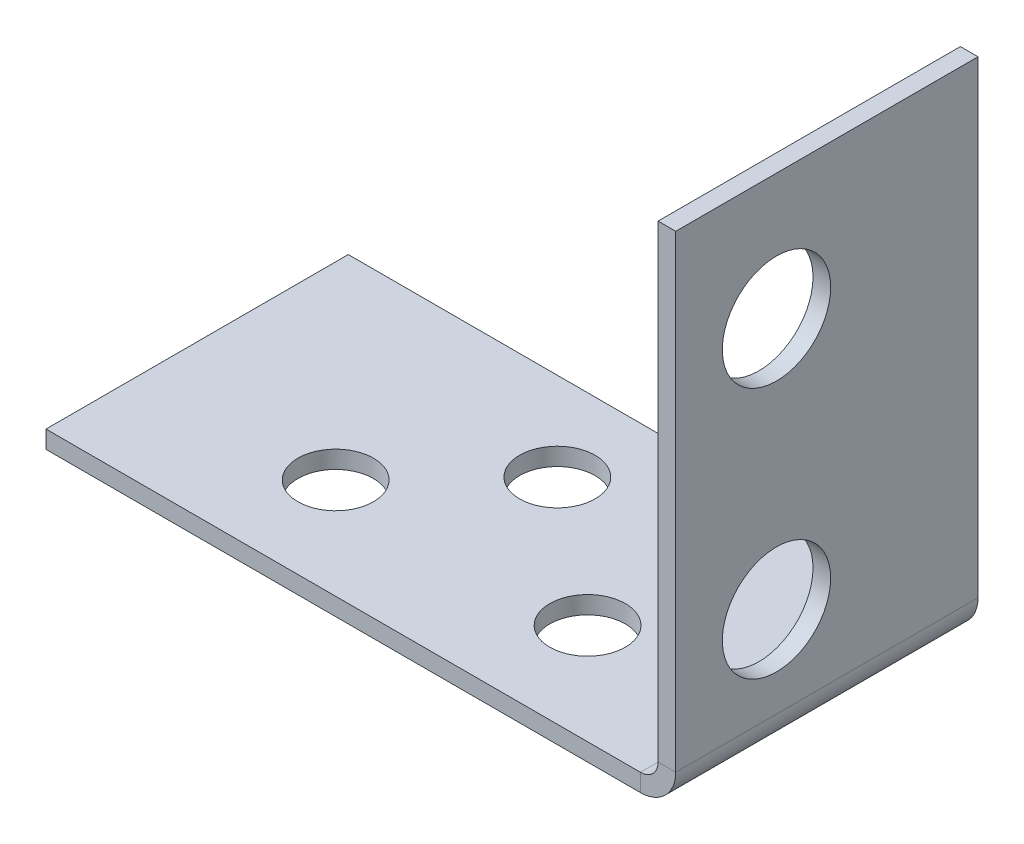
ISO-10303-21;
HEADER;
FILE_DESCRIPTION(('STEP AP214'),'2;1');
FILE_NAME('part.step','',(''),(''),'','','');
FILE_SCHEMA(('AUTOMOTIVE_DESIGN { 1 0 10303 214 1 1 1 1 }'));
ENDSEC;
DATA;
#1=APPLICATION_CONTEXT('core data for automotive mechanical design processes');
#2=APPLICATION_PROTOCOL_DEFINITION('international standard','automotive_design',2000,#1);
#3=PRODUCT_CONTEXT('',#1,'mechanical');
#4=PRODUCT('Part','Part','',(#3));
#5=PRODUCT_RELATED_PRODUCT_CATEGORY('part','',(#4));
#6=PRODUCT_DEFINITION_FORMATION('','',#4);
#7=PRODUCT_DEFINITION_CONTEXT('part definition',#1,'design');
#8=PRODUCT_DEFINITION('design','',#6,#7);
#9=PRODUCT_DEFINITION_SHAPE('','',#8);
#10=(LENGTH_UNIT() NAMED_UNIT(*) SI_UNIT(.MILLI.,.METRE.));
#11=(NAMED_UNIT(*) PLANE_ANGLE_UNIT() SI_UNIT($,.RADIAN.));
#12=(NAMED_UNIT(*) SI_UNIT($,.STERADIAN.) SOLID_ANGLE_UNIT());
#13=UNCERTAINTY_MEASURE_WITH_UNIT(LENGTH_MEASURE(1.E-05),#10,'distance_accuracy_value','');
#14=(GEOMETRIC_REPRESENTATION_CONTEXT(3) GLOBAL_UNCERTAINTY_ASSIGNED_CONTEXT((#13)) GLOBAL_UNIT_ASSIGNED_CONTEXT((#10,
#11,#12)) REPRESENTATION_CONTEXT('',''));
#15=CARTESIAN_POINT('',(0.,0.,0.));
#16=DIRECTION('',(0.,0.,1.));
#17=DIRECTION('',(1.,0.,0.));
#18=AXIS2_PLACEMENT_3D('',#15,#16,#17);
#19=CARTESIAN_POINT('',(23.6,0.,12.));
#20=DIRECTION('',(0.,0.,1.));
#21=DIRECTION('',(1.,0.,0.));
#22=AXIS2_PLACEMENT_3D('',#19,#20,#21);
#23=PLANE('',#22);
#24=DIRECTION('',(0.,1.,0.));
#25=VECTOR('',#24,1.);
#26=CARTESIAN_POINT('',(23.6,0.,12.));
#27=LINE('',#26,#25);
#28=CARTESIAN_POINT('',(23.6,0.,12.));
#29=VERTEX_POINT('',#28);
#30=CARTESIAN_POINT('',(23.6,0.7,12.));
#31=VERTEX_POINT('',#30);
#32=EDGE_CURVE('E11',#29,#31,#27,.T.);
#33=ORIENTED_EDGE('',*,*,#32,.F.);
#34=CARTESIAN_POINT('',(23.6,1.4,12.));
#35=DIRECTION('',(0.,0.,-1.));
#36=DIRECTION('',(-1.,0.,0.));
#37=AXIS2_PLACEMENT_3D('',#34,#35,#36);
#38=CIRCLE('',#37,1.4);
#39=CARTESIAN_POINT('',(25.,1.4,12.));
#40=VERTEX_POINT('',#39);
#41=EDGE_CURVE('E131',#29,#40,#38,.F.);
#42=ORIENTED_EDGE('',*,*,#41,.T.);
#43=DIRECTION('',(1.,0.,0.));
#44=VECTOR('',#43,1.);
#45=CARTESIAN_POINT('',(24.3,1.4,12.));
#46=LINE('',#45,#44);
#47=CARTESIAN_POINT('',(24.3,1.4,12.));
#48=VERTEX_POINT('',#47);
#49=EDGE_CURVE('E49',#48,#40,#46,.T.);
#50=ORIENTED_EDGE('',*,*,#49,.F.);
#51=CARTESIAN_POINT('',(23.6,1.4,12.));
#52=DIRECTION('',(0.,0.,1.));
#53=DIRECTION('',(1.,0.,0.));
#54=AXIS2_PLACEMENT_3D('',#51,#52,#53);
#55=CIRCLE('',#54,0.7);
#56=EDGE_CURVE('E138',#31,#48,#55,.T.);
#57=ORIENTED_EDGE('',*,*,#56,.F.);
#58=EDGE_LOOP('',(#33,#42,#50,#57));
#59=FACE_BOUND('',#58,.T.);
#60=ADVANCED_FACE('F41',(#59),#23,.T.);
#61=CARTESIAN_POINT('',(24.3,1.4,12.));
#62=DIRECTION('',(0.,0.,1.));
#63=DIRECTION('',(1.,0.,0.));
#64=AXIS2_PLACEMENT_3D('',#61,#62,#63);
#65=PLANE('',#64);
#66=DIRECTION('',(1.,0.,0.));
#67=VECTOR('',#66,1.);
#68=CARTESIAN_POINT('',(0.,0.,12.));
#69=LINE('',#68,#67);
#70=CARTESIAN_POINT('',(0.,0.,12.));
#71=VERTEX_POINT('',#70);
#72=EDGE_CURVE('E126',#71,#29,#69,.T.);
#73=ORIENTED_EDGE('',*,*,#72,.T.);
#74=ORIENTED_EDGE('',*,*,#32,.T.);
#75=DIRECTION('',(1.,0.,0.));
#76=VECTOR('',#75,1.);
#77=CARTESIAN_POINT('',(0.,0.7,12.));
#78=LINE('',#77,#76);
#79=CARTESIAN_POINT('',(0.,0.7,12.));
#80=VERTEX_POINT('',#79);
#81=EDGE_CURVE('E136',#80,#31,#78,.T.);
#82=ORIENTED_EDGE('',*,*,#81,.F.);
#83=DIRECTION('',(0.,1.,0.));
#84=VECTOR('',#83,1.);
#85=CARTESIAN_POINT('',(0.,0.,12.));
#86=LINE('',#85,#84);
#87=EDGE_CURVE('E117',#71,#80,#86,.T.);
#88=ORIENTED_EDGE('',*,*,#87,.F.);
#89=EDGE_LOOP('',(#73,#74,#82,#88));
#90=FACE_BOUND('',#89,.T.);
#91=ADVANCED_FACE('F134',(#90),#65,.T.);
#92=CARTESIAN_POINT('',(25.,1.4,0.));
#93=DIRECTION('',(0.,0.,-1.));
#94=DIRECTION('',(-1.,0.,0.));
#95=AXIS2_PLACEMENT_3D('',#92,#93,#94);
#96=PLANE('',#95);
#97=DIRECTION('',(-1.,0.,0.));
#98=VECTOR('',#97,1.);
#99=CARTESIAN_POINT('',(25.,1.4,0.));
#100=LINE('',#99,#98);
#101=CARTESIAN_POINT('',(25.,1.4,0.));
#102=VERTEX_POINT('',#101);
#103=CARTESIAN_POINT('',(24.3,1.4,0.));
#104=VERTEX_POINT('',#103);
#105=EDGE_CURVE('E92',#102,#104,#100,.T.);
#106=ORIENTED_EDGE('',*,*,#105,.F.);
#107=CARTESIAN_POINT('',(23.6,1.4,0.));
#108=DIRECTION('',(0.,0.,-1.));
#109=DIRECTION('',(-1.,0.,0.));
#110=AXIS2_PLACEMENT_3D('',#107,#108,#109);
#111=CIRCLE('',#110,1.4);
#112=CARTESIAN_POINT('',(23.6,0.,0.));
#113=VERTEX_POINT('',#112);
#114=EDGE_CURVE('E161',#113,#102,#111,.F.);
#115=ORIENTED_EDGE('',*,*,#114,.F.);
#116=DIRECTION('',(0.,-1.,0.));
#117=VECTOR('',#116,1.);
#118=CARTESIAN_POINT('',(23.6,0.7,0.));
#119=LINE('',#118,#117);
#120=CARTESIAN_POINT('',(23.6,0.7,0.));
#121=VERTEX_POINT('',#120);
#122=EDGE_CURVE('E85',#121,#113,#119,.T.);
#123=ORIENTED_EDGE('',*,*,#122,.F.);
#124=CARTESIAN_POINT('',(23.6,1.4,0.));
#125=DIRECTION('',(0.,0.,1.));
#126=DIRECTION('',(1.,0.,0.));
#127=AXIS2_PLACEMENT_3D('',#124,#125,#126);
#128=CIRCLE('',#127,0.7);
#129=EDGE_CURVE('E154',#121,#104,#128,.T.);
#130=ORIENTED_EDGE('',*,*,#129,.T.);
#131=EDGE_LOOP('',(#106,#115,#123,#130));
#132=FACE_BOUND('',#131,.T.);
#133=ADVANCED_FACE('F193',(#132),#96,.T.);
#134=CARTESIAN_POINT('',(23.6,0.7,0.));
#135=DIRECTION('',(0.,0.,-1.));
#136=DIRECTION('',(-1.,0.,0.));
#137=AXIS2_PLACEMENT_3D('',#134,#135,#136);
#138=PLANE('',#137);
#139=DIRECTION('',(0.,1.,0.));
#140=VECTOR('',#139,1.);
#141=CARTESIAN_POINT('',(25.,0.,0.));
#142=LINE('',#141,#140);
#143=CARTESIAN_POINT('',(25.,20.,0.));
#144=VERTEX_POINT('',#143);
#145=EDGE_CURVE('E144',#102,#144,#142,.T.);
#146=ORIENTED_EDGE('',*,*,#145,.F.);
#147=ORIENTED_EDGE('',*,*,#105,.T.);
#148=DIRECTION('',(0.,1.,0.));
#149=VECTOR('',#148,1.);
#150=CARTESIAN_POINT('',(24.3,0.,0.));
#151=LINE('',#150,#149);
#152=CARTESIAN_POINT('',(24.3,20.,0.));
#153=VERTEX_POINT('',#152);
#154=EDGE_CURVE('E151',#104,#153,#151,.T.);
#155=ORIENTED_EDGE('',*,*,#154,.T.);
#156=DIRECTION('',(1.,0.,0.));
#157=VECTOR('',#156,1.);
#158=CARTESIAN_POINT('',(24.3,20.,0.));
#159=LINE('',#158,#157);
#160=EDGE_CURVE('E147',#153,#144,#159,.T.);
#161=ORIENTED_EDGE('',*,*,#160,.T.);
#162=EDGE_LOOP('',(#146,#147,#155,#161));
#163=FACE_BOUND('',#162,.T.);
#164=ADVANCED_FACE('F180',(#163),#138,.T.);
#165=CARTESIAN_POINT('',(25.,0.,12.));
#166=DIRECTION('',(-1.,0.,0.));
#167=DIRECTION('',(0.,0.,1.));
#168=AXIS2_PLACEMENT_3D('',#165,#166,#167);
#169=PLANE('',#168);
#170=CARTESIAN_POINT('',(25.,15.,8.));
#171=DIRECTION('',(1.,0.,0.));
#172=DIRECTION('',(0.,0.,-1.));
#173=AXIS2_PLACEMENT_3D('',#170,#171,#172);
#174=CIRCLE('',#173,2.15);
#175=CARTESIAN_POINT('',(25.,15.,5.85));
#176=VERTEX_POINT('',#175);
#177=EDGE_CURVE('E226',#176,#176,#174,.T.);
#178=ORIENTED_EDGE('',*,*,#177,.F.);
#179=EDGE_LOOP('',(#178));
#180=FACE_BOUND('',#179,.T.);
#181=CARTESIAN_POINT('',(25.,5.,8.));
#182=DIRECTION('',(1.,0.,0.));
#183=DIRECTION('',(0.,0.,-1.));
#184=AXIS2_PLACEMENT_3D('',#181,#182,#183);
#185=CIRCLE('',#184,2.15);
#186=CARTESIAN_POINT('',(25.,5.,5.85));
#187=VERTEX_POINT('',#186);
#188=EDGE_CURVE('E227',#187,#187,#185,.T.);
#189=ORIENTED_EDGE('',*,*,#188,.F.);
#190=EDGE_LOOP('',(#189));
#191=FACE_BOUND('',#190,.T.);
#192=ORIENTED_EDGE('',*,*,#145,.T.);
#193=DIRECTION('',(0.,0.,-1.));
#194=VECTOR('',#193,1.);
#195=CARTESIAN_POINT('',(25.,20.,12.));
#196=LINE('',#195,#194);
#197=CARTESIAN_POINT('',(25.,20.,12.));
#198=VERTEX_POINT('',#197);
#199=EDGE_CURVE('E175',#198,#144,#196,.T.);
#200=ORIENTED_EDGE('',*,*,#199,.F.);
#201=DIRECTION('',(0.,1.,0.));
#202=VECTOR('',#201,1.);
#203=CARTESIAN_POINT('',(25.,0.,12.));
#204=LINE('',#203,#202);
#205=EDGE_CURVE('E98',#40,#198,#204,.T.);
#206=ORIENTED_EDGE('',*,*,#205,.F.);
#207=DIRECTION('',(0.,0.,-1.));
#208=VECTOR('',#207,1.);
#209=CARTESIAN_POINT('',(25.,1.4,12.));
#210=LINE('',#209,#208);
#211=EDGE_CURVE('E143',#40,#102,#210,.T.);
#212=ORIENTED_EDGE('',*,*,#211,.T.);
#213=EDGE_LOOP('',(#192,#200,#206,#212));
#214=FACE_BOUND('',#213,.T.);
#215=ADVANCED_FACE('F238',(#180,#191,#214),#169,.F.);
#216=CARTESIAN_POINT('',(24.3,20.,12.));
#217=DIRECTION('',(0.,1.,0.));
#218=DIRECTION('',(0.,0.,1.));
#219=AXIS2_PLACEMENT_3D('',#216,#217,#218);
#220=PLANE('',#219);
#221=ORIENTED_EDGE('',*,*,#160,.F.);
#222=DIRECTION('',(0.,0.,-1.));
#223=VECTOR('',#222,1.);
#224=CARTESIAN_POINT('',(24.3,20.,12.));
#225=LINE('',#224,#223);
#226=CARTESIAN_POINT('',(24.3,20.,12.));
#227=VERTEX_POINT('',#226);
#228=EDGE_CURVE('E173',#227,#153,#225,.T.);
#229=ORIENTED_EDGE('',*,*,#228,.F.);
#230=DIRECTION('',(1.,0.,0.));
#231=VECTOR('',#230,1.);
#232=CARTESIAN_POINT('',(24.3,20.,12.));
#233=LINE('',#232,#231);
#234=EDGE_CURVE('E199',#227,#198,#233,.T.);
#235=ORIENTED_EDGE('',*,*,#234,.T.);
#236=ORIENTED_EDGE('',*,*,#199,.T.);
#237=EDGE_LOOP('',(#221,#229,#235,#236));
#238=FACE_BOUND('',#237,.T.);
#239=ADVANCED_FACE('F241',(#238),#220,.T.);
#240=CARTESIAN_POINT('',(24.3,0.,12.));
#241=DIRECTION('',(-1.,0.,0.));
#242=DIRECTION('',(0.,0.,1.));
#243=AXIS2_PLACEMENT_3D('',#240,#241,#242);
#244=PLANE('',#243);
#245=CARTESIAN_POINT('',(24.3,15.,8.));
#246=DIRECTION('',(-1.,0.,0.));
#247=DIRECTION('',(0.,0.,1.));
#248=AXIS2_PLACEMENT_3D('',#245,#246,#247);
#249=CIRCLE('',#248,2.15);
#250=CARTESIAN_POINT('',(24.3,15.,5.85));
#251=VERTEX_POINT('',#250);
#252=EDGE_CURVE('E212',#251,#251,#249,.F.);
#253=ORIENTED_EDGE('',*,*,#252,.T.);
#254=EDGE_LOOP('',(#253));
#255=FACE_BOUND('',#254,.T.);
#256=CARTESIAN_POINT('',(24.3,5.,8.));
#257=DIRECTION('',(-1.,0.,0.));
#258=DIRECTION('',(0.,0.,1.));
#259=AXIS2_PLACEMENT_3D('',#256,#257,#258);
#260=CIRCLE('',#259,2.15);
#261=CARTESIAN_POINT('',(24.3,5.,5.85));
#262=VERTEX_POINT('',#261);
#263=EDGE_CURVE('E223',#262,#262,#260,.F.);
#264=ORIENTED_EDGE('',*,*,#263,.T.);
#265=EDGE_LOOP('',(#264));
#266=FACE_BOUND('',#265,.T.);
#267=ORIENTED_EDGE('',*,*,#154,.F.);
#268=DIRECTION('',(0.,0.,-1.));
#269=VECTOR('',#268,1.);
#270=CARTESIAN_POINT('',(24.3,1.4,12.));
#271=LINE('',#270,#269);
#272=EDGE_CURVE('E170',#48,#104,#271,.T.);
#273=ORIENTED_EDGE('',*,*,#272,.F.);
#274=DIRECTION('',(0.,1.,0.));
#275=VECTOR('',#274,1.);
#276=CARTESIAN_POINT('',(24.3,0.,12.));
#277=LINE('',#276,#275);
#278=EDGE_CURVE('E198',#48,#227,#277,.T.);
#279=ORIENTED_EDGE('',*,*,#278,.T.);
#280=ORIENTED_EDGE('',*,*,#228,.T.);
#281=EDGE_LOOP('',(#267,#273,#279,#280));
#282=FACE_BOUND('',#281,.T.);
#283=ADVANCED_FACE('F191',(#255,#266,#282),#244,.T.);
#284=CARTESIAN_POINT('',(23.6,1.4,12.));
#285=DIRECTION('',(0.,0.,-1.));
#286=DIRECTION('',(-1.,0.,0.));
#287=AXIS2_PLACEMENT_3D('',#284,#285,#286);
#288=CYLINDRICAL_SURFACE('',#287,0.7);
#289=ORIENTED_EDGE('',*,*,#129,.F.);
#290=DIRECTION('',(0.,0.,-1.));
#291=VECTOR('',#290,1.);
#292=CARTESIAN_POINT('',(23.6,0.7,12.));
#293=LINE('',#292,#291);
#294=EDGE_CURVE('E167',#31,#121,#293,.T.);
#295=ORIENTED_EDGE('',*,*,#294,.F.);
#296=ORIENTED_EDGE('',*,*,#56,.T.);
#297=ORIENTED_EDGE('',*,*,#272,.T.);
#298=EDGE_LOOP('',(#289,#295,#296,#297));
#299=FACE_BOUND('',#298,.T.);
#300=ADVANCED_FACE('F186',(#299),#288,.F.);
#301=CARTESIAN_POINT('',(0.,0.7,12.));
#302=DIRECTION('',(0.,1.,0.));
#303=DIRECTION('',(0.,0.,1.));
#304=AXIS2_PLACEMENT_3D('',#301,#302,#303);
#305=PLANE('',#304);
#306=CARTESIAN_POINT('',(7.5,0.7,8.));
#307=DIRECTION('',(0.,1.,0.));
#308=DIRECTION('',(0.,0.,1.));
#309=AXIS2_PLACEMENT_3D('',#306,#307,#308);
#310=CIRCLE('',#309,1.5);
#311=CARTESIAN_POINT('',(7.5,0.7,9.5));
#312=VERTEX_POINT('',#311);
#313=EDGE_CURVE('E216',#312,#312,#310,.T.);
#314=ORIENTED_EDGE('',*,*,#313,.F.);
#315=EDGE_LOOP('',(#314));
#316=FACE_BOUND('',#315,.T.);
#317=CARTESIAN_POINT('',(17.5,0.7,8.));
#318=DIRECTION('',(0.,1.,0.));
#319=DIRECTION('',(0.,0.,1.));
#320=AXIS2_PLACEMENT_3D('',#317,#318,#319);
#321=CIRCLE('',#320,1.5);
#322=CARTESIAN_POINT('',(17.5,0.7,9.5));
#323=VERTEX_POINT('',#322);
#324=EDGE_CURVE('E208',#323,#323,#321,.T.);
#325=ORIENTED_EDGE('',*,*,#324,.F.);
#326=EDGE_LOOP('',(#325));
#327=FACE_BOUND('',#326,.T.);
#328=CARTESIAN_POINT('',(11.8,0.7,3.5));
#329=DIRECTION('',(0.,1.,0.));
#330=DIRECTION('',(0.,0.,1.));
#331=AXIS2_PLACEMENT_3D('',#328,#329,#330);
#332=CIRCLE('',#331,1.5);
#333=CARTESIAN_POINT('',(11.8,0.7,5.));
#334=VERTEX_POINT('',#333);
#335=EDGE_CURVE('E209',#334,#334,#332,.T.);
#336=ORIENTED_EDGE('',*,*,#335,.F.);
#337=EDGE_LOOP('',(#336));
#338=FACE_BOUND('',#337,.T.);
#339=DIRECTION('',(1.,0.,0.));
#340=VECTOR('',#339,1.);
#341=CARTESIAN_POINT('',(0.,0.7,0.));
#342=LINE('',#341,#340);
#343=CARTESIAN_POINT('',(0.,0.7,0.));
#344=VERTEX_POINT('',#343);
#345=EDGE_CURVE('E156',#344,#121,#342,.T.);
#346=ORIENTED_EDGE('',*,*,#345,.F.);
#347=DIRECTION('',(0.,0.,-1.));
#348=VECTOR('',#347,1.);
#349=CARTESIAN_POINT('',(0.,0.7,12.));
#350=LINE('',#349,#348);
#351=EDGE_CURVE('E121',#80,#344,#350,.T.);
#352=ORIENTED_EDGE('',*,*,#351,.F.);
#353=ORIENTED_EDGE('',*,*,#81,.T.);
#354=ORIENTED_EDGE('',*,*,#294,.T.);
#355=EDGE_LOOP('',(#346,#352,#353,#354));
#356=FACE_BOUND('',#355,.T.);
#357=ADVANCED_FACE('F196',(#316,#327,#338,#356),#305,.T.);
#358=CARTESIAN_POINT('',(0.,0.,12.));
#359=DIRECTION('',(-1.,0.,0.));
#360=DIRECTION('',(0.,0.,1.));
#361=AXIS2_PLACEMENT_3D('',#358,#359,#360);
#362=PLANE('',#361);
#363=DIRECTION('',(0.,1.,0.));
#364=VECTOR('',#363,1.);
#365=CARTESIAN_POINT('',(0.,0.,0.));
#366=LINE('',#365,#364);
#367=CARTESIAN_POINT('',(0.,0.,0.));
#368=VERTEX_POINT('',#367);
#369=EDGE_CURVE('E119',#368,#344,#366,.T.);
#370=ORIENTED_EDGE('',*,*,#369,.F.);
#371=DIRECTION('',(0.,0.,-1.));
#372=VECTOR('',#371,1.);
#373=CARTESIAN_POINT('',(0.,0.,12.));
#374=LINE('',#373,#372);
#375=EDGE_CURVE('E113',#71,#368,#374,.T.);
#376=ORIENTED_EDGE('',*,*,#375,.F.);
#377=ORIENTED_EDGE('',*,*,#87,.T.);
#378=ORIENTED_EDGE('',*,*,#351,.T.);
#379=EDGE_LOOP('',(#370,#376,#377,#378));
#380=FACE_BOUND('',#379,.T.);
#381=ADVANCED_FACE('F115',(#380),#362,.T.);
#382=CARTESIAN_POINT('',(0.,0.,12.));
#383=DIRECTION('',(0.,1.,0.));
#384=DIRECTION('',(0.,0.,1.));
#385=AXIS2_PLACEMENT_3D('',#382,#383,#384);
#386=PLANE('',#385);
#387=CARTESIAN_POINT('',(7.5,0.,8.));
#388=DIRECTION('',(0.,1.,0.));
#389=DIRECTION('',(0.,0.,1.));
#390=AXIS2_PLACEMENT_3D('',#387,#388,#389);
#391=CIRCLE('',#390,1.5);
#392=CARTESIAN_POINT('',(7.5,0.,9.5));
#393=VERTEX_POINT('',#392);
#394=EDGE_CURVE('E148',#393,#393,#391,.F.);
#395=ORIENTED_EDGE('',*,*,#394,.F.);
#396=EDGE_LOOP('',(#395));
#397=FACE_BOUND('',#396,.T.);
#398=CARTESIAN_POINT('',(17.5,0.,8.));
#399=DIRECTION('',(0.,1.,0.));
#400=DIRECTION('',(0.,0.,1.));
#401=AXIS2_PLACEMENT_3D('',#398,#399,#400);
#402=CIRCLE('',#401,1.5);
#403=CARTESIAN_POINT('',(17.5,0.,9.5));
#404=VERTEX_POINT('',#403);
#405=EDGE_CURVE('E213',#404,#404,#402,.F.);
#406=ORIENTED_EDGE('',*,*,#405,.F.);
#407=EDGE_LOOP('',(#406));
#408=FACE_BOUND('',#407,.T.);
#409=CARTESIAN_POINT('',(11.8,0.,3.5));
#410=DIRECTION('',(0.,1.,0.));
#411=DIRECTION('',(0.,0.,1.));
#412=AXIS2_PLACEMENT_3D('',#409,#410,#411);
#413=CIRCLE('',#412,1.5);
#414=CARTESIAN_POINT('',(11.8,0.,5.));
#415=VERTEX_POINT('',#414);
#416=EDGE_CURVE('E205',#415,#415,#413,.F.);
#417=ORIENTED_EDGE('',*,*,#416,.F.);
#418=EDGE_LOOP('',(#417));
#419=FACE_BOUND('',#418,.T.);
#420=DIRECTION('',(1.,0.,0.));
#421=VECTOR('',#420,1.);
#422=CARTESIAN_POINT('',(0.,0.,0.));
#423=LINE('',#422,#421);
#424=EDGE_CURVE('E159',#368,#113,#423,.T.);
#425=ORIENTED_EDGE('',*,*,#424,.T.);
#426=DIRECTION('',(0.,0.,-1.));
#427=VECTOR('',#426,1.);
#428=CARTESIAN_POINT('',(23.6,0.,12.));
#429=LINE('',#428,#427);
#430=EDGE_CURVE('E122',#29,#113,#429,.T.);
#431=ORIENTED_EDGE('',*,*,#430,.F.);
#432=ORIENTED_EDGE('',*,*,#72,.F.);
#433=ORIENTED_EDGE('',*,*,#375,.T.);
#434=EDGE_LOOP('',(#425,#431,#432,#433));
#435=FACE_BOUND('',#434,.T.);
#436=ADVANCED_FACE('F127',(#397,#408,#419,#435),#386,.F.);
#437=CARTESIAN_POINT('',(23.6,1.4,12.));
#438=DIRECTION('',(0.,0.,-1.));
#439=DIRECTION('',(-1.,0.,0.));
#440=AXIS2_PLACEMENT_3D('',#437,#438,#439);
#441=CYLINDRICAL_SURFACE('',#440,1.4);
#442=ORIENTED_EDGE('',*,*,#114,.T.);
#443=ORIENTED_EDGE('',*,*,#211,.F.);
#444=ORIENTED_EDGE('',*,*,#41,.F.);
#445=ORIENTED_EDGE('',*,*,#430,.T.);
#446=EDGE_LOOP('',(#442,#443,#444,#445));
#447=FACE_BOUND('',#446,.T.);
#448=ADVANCED_FACE('F250',(#447),#441,.T.);
#449=CARTESIAN_POINT('',(23.6,1.4,12.));
#450=DIRECTION('',(0.,0.,1.));
#451=DIRECTION('',(1.,0.,0.));
#452=AXIS2_PLACEMENT_3D('',#449,#450,#451);
#453=PLANE('',#452);
#454=ORIENTED_EDGE('',*,*,#205,.T.);
#455=ORIENTED_EDGE('',*,*,#234,.F.);
#456=ORIENTED_EDGE('',*,*,#278,.F.);
#457=ORIENTED_EDGE('',*,*,#49,.T.);
#458=EDGE_LOOP('',(#454,#455,#456,#457));
#459=FACE_BOUND('',#458,.T.);
#460=ADVANCED_FACE('F247',(#459),#453,.T.);
#461=CARTESIAN_POINT('',(23.6,1.4,0.));
#462=DIRECTION('',(0.,0.,1.));
#463=DIRECTION('',(1.,0.,0.));
#464=AXIS2_PLACEMENT_3D('',#461,#462,#463);
#465=PLANE('',#464);
#466=ORIENTED_EDGE('',*,*,#345,.T.);
#467=ORIENTED_EDGE('',*,*,#122,.T.);
#468=ORIENTED_EDGE('',*,*,#424,.F.);
#469=ORIENTED_EDGE('',*,*,#369,.T.);
#470=EDGE_LOOP('',(#466,#467,#468,#469));
#471=FACE_BOUND('',#470,.T.);
#472=ADVANCED_FACE('F249',(#471),#465,.F.);
#473=CARTESIAN_POINT('',(11.8,-4.24264068711929,3.5));
#474=DIRECTION('',(0.,1.,0.));
#475=DIRECTION('',(0.,0.,1.));
#476=AXIS2_PLACEMENT_3D('',#473,#474,#475);
#477=CYLINDRICAL_SURFACE('',#476,1.5);
#478=ORIENTED_EDGE('',*,*,#416,.T.);
#479=EDGE_LOOP('',(#478));
#480=FACE_BOUND('',#479,.T.);
#481=ORIENTED_EDGE('',*,*,#335,.T.);
#482=EDGE_LOOP('',(#481));
#483=FACE_BOUND('',#482,.T.);
#484=ADVANCED_FACE('F256',(#480,#483),#477,.F.);
#485=CARTESIAN_POINT('',(17.5,-4.24264068711929,8.));
#486=DIRECTION('',(0.,1.,0.));
#487=DIRECTION('',(0.,0.,1.));
#488=AXIS2_PLACEMENT_3D('',#485,#486,#487);
#489=CYLINDRICAL_SURFACE('',#488,1.5);
#490=ORIENTED_EDGE('',*,*,#405,.T.);
#491=EDGE_LOOP('',(#490));
#492=FACE_BOUND('',#491,.T.);
#493=ORIENTED_EDGE('',*,*,#324,.T.);
#494=EDGE_LOOP('',(#493));
#495=FACE_BOUND('',#494,.T.);
#496=ADVANCED_FACE('F296',(#492,#495),#489,.F.);
#497=CARTESIAN_POINT('',(7.5,-4.24264068711929,8.));
#498=DIRECTION('',(0.,1.,0.));
#499=DIRECTION('',(0.,0.,1.));
#500=AXIS2_PLACEMENT_3D('',#497,#498,#499);
#501=CYLINDRICAL_SURFACE('',#500,1.5);
#502=ORIENTED_EDGE('',*,*,#394,.T.);
#503=EDGE_LOOP('',(#502));
#504=FACE_BOUND('',#503,.T.);
#505=ORIENTED_EDGE('',*,*,#313,.T.);
#506=EDGE_LOOP('',(#505));
#507=FACE_BOUND('',#506,.T.);
#508=ADVANCED_FACE('F302',(#504,#507),#501,.F.);
#509=CARTESIAN_POINT('',(18.2188816817957,5.,8.));
#510=DIRECTION('',(1.,0.,0.));
#511=DIRECTION('',(0.,0.,-1.));
#512=AXIS2_PLACEMENT_3D('',#509,#510,#511);
#513=CYLINDRICAL_SURFACE('',#512,2.15);
#514=CARTESIAN_POINT('',(25.,5.,5.85));
#515=CARTESIAN_POINT('',(24.9927083333333,5.,5.85));
#516=CARTESIAN_POINT('',(24.9854166666667,5.,5.85));
#517=CARTESIAN_POINT('',(24.9708333333333,5.,5.85));
#518=CARTESIAN_POINT('',(24.9635416666667,5.,5.85));
#519=CARTESIAN_POINT('',(24.9489583333333,5.,5.85));
#520=CARTESIAN_POINT('',(24.9416666666667,5.,5.85));
#521=CARTESIAN_POINT('',(24.9270833333333,5.,5.85));
#522=CARTESIAN_POINT('',(24.9197916666667,5.,5.85));
#523=CARTESIAN_POINT('',(24.9052083333333,5.,5.85));
#524=CARTESIAN_POINT('',(24.8979166666667,5.,5.85));
#525=CARTESIAN_POINT('',(24.8833333333333,5.,5.85));
#526=CARTESIAN_POINT('',(24.8760416666667,5.,5.85));
#527=CARTESIAN_POINT('',(24.8614583333333,5.,5.85));
#528=CARTESIAN_POINT('',(24.8541666666667,5.,5.85));
#529=CARTESIAN_POINT('',(24.8395833333333,5.,5.85));
#530=CARTESIAN_POINT('',(24.8322916666667,5.,5.85));
#531=CARTESIAN_POINT('',(24.8177083333333,5.,5.85));
#532=CARTESIAN_POINT('',(24.8104166666667,5.,5.85));
#533=CARTESIAN_POINT('',(24.7958333333333,5.,5.85));
#534=CARTESIAN_POINT('',(24.7885416666667,5.,5.85));
#535=CARTESIAN_POINT('',(24.7739583333333,5.,5.85));
#536=CARTESIAN_POINT('',(24.7666666666667,5.,5.85));
#537=CARTESIAN_POINT('',(24.7520833333333,5.,5.85));
#538=CARTESIAN_POINT('',(24.7447916666667,5.,5.85));
#539=CARTESIAN_POINT('',(24.7302083333333,5.,5.85));
#540=CARTESIAN_POINT('',(24.7229166666667,5.,5.85));
#541=CARTESIAN_POINT('',(24.7083333333333,5.,5.85));
#542=CARTESIAN_POINT('',(24.7010416666667,5.,5.85));
#543=CARTESIAN_POINT('',(24.6864583333333,5.,5.85));
#544=CARTESIAN_POINT('',(24.6791666666667,5.,5.85));
#545=CARTESIAN_POINT('',(24.6645833333333,5.,5.85));
#546=CARTESIAN_POINT('',(24.6572916666667,5.,5.85));
#547=CARTESIAN_POINT('',(24.6427083333333,5.,5.85));
#548=CARTESIAN_POINT('',(24.6354166666667,5.,5.85));
#549=CARTESIAN_POINT('',(24.6208333333333,5.,5.85));
#550=CARTESIAN_POINT('',(24.6135416666667,5.,5.85));
#551=CARTESIAN_POINT('',(24.5989583333333,5.,5.85));
#552=CARTESIAN_POINT('',(24.5916666666667,5.,5.85));
#553=CARTESIAN_POINT('',(24.5770833333333,5.,5.85));
#554=CARTESIAN_POINT('',(24.5697916666667,5.,5.85));
#555=CARTESIAN_POINT('',(24.5552083333333,5.,5.85));
#556=CARTESIAN_POINT('',(24.5479166666667,5.,5.85));
#557=CARTESIAN_POINT('',(24.5333333333333,5.,5.85));
#558=CARTESIAN_POINT('',(24.5260416666667,5.,5.85));
#559=CARTESIAN_POINT('',(24.5114583333333,5.,5.85));
#560=CARTESIAN_POINT('',(24.5041666666667,5.,5.85));
#561=CARTESIAN_POINT('',(24.4895833333333,5.,5.85));
#562=CARTESIAN_POINT('',(24.4822916666667,5.,5.85));
#563=CARTESIAN_POINT('',(24.4677083333333,5.,5.85));
#564=CARTESIAN_POINT('',(24.4604166666667,5.,5.85));
#565=CARTESIAN_POINT('',(24.4458333333333,5.,5.85));
#566=CARTESIAN_POINT('',(24.4385416666667,5.,5.85));
#567=CARTESIAN_POINT('',(24.4239583333333,5.,5.85));
#568=CARTESIAN_POINT('',(24.4166666666667,5.,5.85));
#569=CARTESIAN_POINT('',(24.4020833333333,5.,5.85));
#570=CARTESIAN_POINT('',(24.3947916666667,5.,5.85));
#571=CARTESIAN_POINT('',(24.3802083333333,5.,5.85));
#572=CARTESIAN_POINT('',(24.3729166666667,5.,5.85));
#573=CARTESIAN_POINT('',(24.3583333333333,5.,5.85));
#574=CARTESIAN_POINT('',(24.3510416666667,5.,5.85));
#575=CARTESIAN_POINT('',(24.3364583333333,5.,5.85));
#576=CARTESIAN_POINT('',(24.3291666666667,5.,5.85));
#577=CARTESIAN_POINT('',(24.3145833333333,5.,5.85));
#578=CARTESIAN_POINT('',(24.3072916666667,5.,5.85));
#579=CARTESIAN_POINT('',(24.3,5.,5.85));
#580=B_SPLINE_CURVE_WITH_KNOTS('',3,(#514,#515,#516,#517,#518,#519,#520,#521,#522,#523,#524,
#525,#526,#527,#528,#529,#530,#531,#532,#533,#534,#535,#536,#537,#538,#539,#540,#541,#542,#543,
#544,#545,#546,#547,#548,#549,#550,#551,#552,#553,#554,#555,#556,#557,#558,#559,#560,#561,#562,
#563,#564,#565,#566,#567,#568,#569,#570,#571,#572,#573,#574,#575,#576,#577,#578,#579),
.UNSPECIFIED.,.F.,.F.,(4,2,2,2,2,2,2,2,2,2,2,2,2,2,2,2,2,2,2,2,2,2,2,2,2,2,2,2,2,2,2,2,4),(0.,
0.0218750000000011,0.0437499999999987,0.0656249999999997,0.0874999999999973,0.109374999999998,
0.131249999999996,0.153124999999997,0.174999999999998,0.196874999999996,0.218749999999997,
0.240624999999998,0.262499999999995,0.284374999999996,0.306249999999997,0.328124999999995,
0.349999999999996,0.371874999999997,0.393749999999995,0.415624999999996,0.437499999999997,
0.459374999999995,0.481249999999996,0.503124999999997,0.524999999999994,0.546874999999995,
0.568749999999996,0.590624999999994,0.612499999999995,0.634374999999993,0.656249999999994,
0.678124999999995,0.699999999999992),.UNSPECIFIED.);
#581=EDGE_CURVE('BSEAM308',#187,#262,#580,.T.);
#582=ORIENTED_EDGE('',*,*,#188,.T.);
#583=ORIENTED_EDGE('',*,*,#263,.F.);
#584=ORIENTED_EDGE('',*,*,#581,.T.);
#585=ORIENTED_EDGE('',*,*,#581,.F.);
#586=EDGE_LOOP('',(#582,#584,#583,#585));
#587=FACE_BOUND('',#586,.T.);
#588=ADVANCED_FACE('F308',(#587),#513,.F.);
#589=CARTESIAN_POINT('',(18.2188816817957,15.,8.));
#590=DIRECTION('',(1.,0.,0.));
#591=DIRECTION('',(0.,0.,-1.));
#592=AXIS2_PLACEMENT_3D('',#589,#590,#591);
#593=CYLINDRICAL_SURFACE('',#592,2.15);
#594=CARTESIAN_POINT('',(25.,15.,5.85));
#595=CARTESIAN_POINT('',(24.9927083333333,15.,5.85));
#596=CARTESIAN_POINT('',(24.9854166666667,15.,5.85));
#597=CARTESIAN_POINT('',(24.9708333333333,15.,5.85));
#598=CARTESIAN_POINT('',(24.9635416666667,15.,5.85));
#599=CARTESIAN_POINT('',(24.9489583333333,15.,5.85));
#600=CARTESIAN_POINT('',(24.9416666666667,15.,5.85));
#601=CARTESIAN_POINT('',(24.9270833333333,15.,5.85));
#602=CARTESIAN_POINT('',(24.9197916666667,15.,5.85));
#603=CARTESIAN_POINT('',(24.9052083333333,15.,5.85));
#604=CARTESIAN_POINT('',(24.8979166666667,15.,5.85));
#605=CARTESIAN_POINT('',(24.8833333333333,15.,5.85));
#606=CARTESIAN_POINT('',(24.8760416666667,15.,5.85));
#607=CARTESIAN_POINT('',(24.8614583333333,15.,5.85));
#608=CARTESIAN_POINT('',(24.8541666666667,15.,5.85));
#609=CARTESIAN_POINT('',(24.8395833333333,15.,5.85));
#610=CARTESIAN_POINT('',(24.8322916666667,15.,5.85));
#611=CARTESIAN_POINT('',(24.8177083333333,15.,5.85));
#612=CARTESIAN_POINT('',(24.8104166666667,15.,5.85));
#613=CARTESIAN_POINT('',(24.7958333333333,15.,5.85));
#614=CARTESIAN_POINT('',(24.7885416666667,15.,5.85));
#615=CARTESIAN_POINT('',(24.7739583333333,15.,5.85));
#616=CARTESIAN_POINT('',(24.7666666666667,15.,5.85));
#617=CARTESIAN_POINT('',(24.7520833333333,15.,5.85));
#618=CARTESIAN_POINT('',(24.7447916666667,15.,5.85));
#619=CARTESIAN_POINT('',(24.7302083333333,15.,5.85));
#620=CARTESIAN_POINT('',(24.7229166666667,15.,5.85));
#621=CARTESIAN_POINT('',(24.7083333333333,15.,5.85));
#622=CARTESIAN_POINT('',(24.7010416666667,15.,5.85));
#623=CARTESIAN_POINT('',(24.6864583333333,15.,5.85));
#624=CARTESIAN_POINT('',(24.6791666666667,15.,5.85));
#625=CARTESIAN_POINT('',(24.6645833333333,15.,5.85));
#626=CARTESIAN_POINT('',(24.6572916666667,15.,5.85));
#627=CARTESIAN_POINT('',(24.6427083333333,15.,5.85));
#628=CARTESIAN_POINT('',(24.6354166666667,15.,5.85));
#629=CARTESIAN_POINT('',(24.6208333333333,15.,5.85));
#630=CARTESIAN_POINT('',(24.6135416666667,15.,5.85));
#631=CARTESIAN_POINT('',(24.5989583333333,15.,5.85));
#632=CARTESIAN_POINT('',(24.5916666666667,15.,5.85));
#633=CARTESIAN_POINT('',(24.5770833333333,15.,5.85));
#634=CARTESIAN_POINT('',(24.5697916666667,15.,5.85));
#635=CARTESIAN_POINT('',(24.5552083333333,15.,5.85));
#636=CARTESIAN_POINT('',(24.5479166666667,15.,5.85));
#637=CARTESIAN_POINT('',(24.5333333333333,15.,5.85));
#638=CARTESIAN_POINT('',(24.5260416666667,15.,5.85));
#639=CARTESIAN_POINT('',(24.5114583333333,15.,5.85));
#640=CARTESIAN_POINT('',(24.5041666666667,15.,5.85));
#641=CARTESIAN_POINT('',(24.4895833333333,15.,5.85));
#642=CARTESIAN_POINT('',(24.4822916666667,15.,5.85));
#643=CARTESIAN_POINT('',(24.4677083333333,15.,5.85));
#644=CARTESIAN_POINT('',(24.4604166666667,15.,5.85));
#645=CARTESIAN_POINT('',(24.4458333333333,15.,5.85));
#646=CARTESIAN_POINT('',(24.4385416666667,15.,5.85));
#647=CARTESIAN_POINT('',(24.4239583333333,15.,5.85));
#648=CARTESIAN_POINT('',(24.4166666666667,15.,5.85));
#649=CARTESIAN_POINT('',(24.4020833333333,15.,5.85));
#650=CARTESIAN_POINT('',(24.3947916666667,15.,5.85));
#651=CARTESIAN_POINT('',(24.3802083333333,15.,5.85));
#652=CARTESIAN_POINT('',(24.3729166666667,15.,5.85));
#653=CARTESIAN_POINT('',(24.3583333333333,15.,5.85));
#654=CARTESIAN_POINT('',(24.3510416666667,15.,5.85));
#655=CARTESIAN_POINT('',(24.3364583333333,15.,5.85));
#656=CARTESIAN_POINT('',(24.3291666666667,15.,5.85));
#657=CARTESIAN_POINT('',(24.3145833333333,15.,5.85));
#658=CARTESIAN_POINT('',(24.3072916666667,15.,5.85));
#659=CARTESIAN_POINT('',(24.3,15.,5.85));
#660=B_SPLINE_CURVE_WITH_KNOTS('',3,(#594,#595,#596,#597,#598,#599,#600,#601,#602,#603,#604,
#605,#606,#607,#608,#609,#610,#611,#612,#613,#614,#615,#616,#617,#618,#619,#620,#621,#622,#623,
#624,#625,#626,#627,#628,#629,#630,#631,#632,#633,#634,#635,#636,#637,#638,#639,#640,#641,#642,
#643,#644,#645,#646,#647,#648,#649,#650,#651,#652,#653,#654,#655,#656,#657,#658,#659),
.UNSPECIFIED.,.F.,.F.,(4,2,2,2,2,2,2,2,2,2,2,2,2,2,2,2,2,2,2,2,2,2,2,2,2,2,2,2,2,2,2,2,4),(0.,
0.0218750000000011,0.0437499999999987,0.0656249999999997,0.0874999999999973,0.109374999999998,
0.131249999999996,0.153124999999997,0.174999999999998,0.196874999999996,0.218749999999997,
0.240624999999998,0.262499999999995,0.284374999999996,0.306249999999997,0.328124999999995,
0.349999999999996,0.371874999999997,0.393749999999995,0.415624999999996,0.437499999999997,
0.459374999999995,0.481249999999996,0.503124999999997,0.524999999999994,0.546874999999995,
0.568749999999996,0.590624999999994,0.612499999999995,0.634374999999993,0.656249999999994,
0.678124999999995,0.699999999999992),.UNSPECIFIED.);
#661=EDGE_CURVE('BSEAM235',#176,#251,#660,.T.);
#662=ORIENTED_EDGE('',*,*,#177,.T.);
#663=ORIENTED_EDGE('',*,*,#252,.F.);
#664=ORIENTED_EDGE('',*,*,#661,.T.);
#665=ORIENTED_EDGE('',*,*,#661,.F.);
#666=EDGE_LOOP('',(#662,#664,#663,#665));
#667=FACE_BOUND('',#666,.T.);
#668=ADVANCED_FACE('F235',(#667),#593,.F.);
#669=CLOSED_SHELL('',(#60,#91,#133,#164,#215,#239,#283,#300,#357,#381,#436,#448,#460,#472,#484,
#496,#508,#588,#668));
#670=MANIFOLD_SOLID_BREP('B2',#669);
#671=ADVANCED_BREP_SHAPE_REPRESENTATION('',(#18,#670),#14);
#672=SHAPE_DEFINITION_REPRESENTATION(#9,#671);
ENDSEC;
END-ISO-10303-21;
